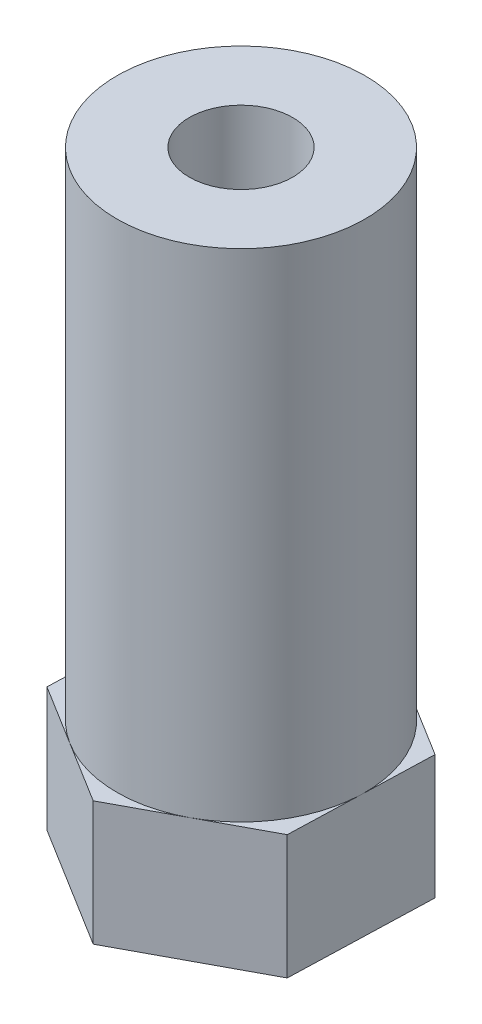
ISO-10303-21;
HEADER;
FILE_DESCRIPTION(('STEP AP214'),'2;1');
FILE_NAME('part.step','',(''),(''),'','','');
FILE_SCHEMA(('AUTOMOTIVE_DESIGN { 1 0 10303 214 1 1 1 1 }'));
ENDSEC;
DATA;
#1=APPLICATION_CONTEXT('core data for automotive mechanical design processes');
#2=APPLICATION_PROTOCOL_DEFINITION('international standard','automotive_design',2000,#1);
#3=PRODUCT_CONTEXT('',#1,'mechanical');
#4=PRODUCT('Part','Part','',(#3));
#5=PRODUCT_RELATED_PRODUCT_CATEGORY('part','',(#4));
#6=PRODUCT_DEFINITION_FORMATION('','',#4);
#7=PRODUCT_DEFINITION_CONTEXT('part definition',#1,'design');
#8=PRODUCT_DEFINITION('design','',#6,#7);
#9=PRODUCT_DEFINITION_SHAPE('','',#8);
#10=(LENGTH_UNIT() NAMED_UNIT(*) SI_UNIT(.MILLI.,.METRE.));
#11=(NAMED_UNIT(*) PLANE_ANGLE_UNIT() SI_UNIT($,.RADIAN.));
#12=(NAMED_UNIT(*) SI_UNIT($,.STERADIAN.) SOLID_ANGLE_UNIT());
#13=UNCERTAINTY_MEASURE_WITH_UNIT(LENGTH_MEASURE(1.E-05),#10,'distance_accuracy_value','');
#14=(GEOMETRIC_REPRESENTATION_CONTEXT(3) GLOBAL_UNCERTAINTY_ASSIGNED_CONTEXT((#13)) GLOBAL_UNIT_ASSIGNED_CONTEXT((#10,
#11,#12)) REPRESENTATION_CONTEXT('',''));
#15=CARTESIAN_POINT('',(0.,0.,0.));
#16=DIRECTION('',(0.,0.,1.));
#17=DIRECTION('',(1.,0.,0.));
#18=AXIS2_PLACEMENT_3D('',#15,#16,#17);
#19=CARTESIAN_POINT('',(0.,6.,0.));
#20=DIRECTION('',(0.,1.,0.));
#21=DIRECTION('',(0.,0.,1.));
#22=AXIS2_PLACEMENT_3D('',#19,#20,#21);
#23=PLANE('',#22);
#24=CARTESIAN_POINT('',(0.,6.,0.));
#25=DIRECTION('',(0.,1.,0.));
#26=DIRECTION('',(0.,0.,1.));
#27=AXIS2_PLACEMENT_3D('',#24,#25,#26);
#28=CIRCLE('',#27,6.);
#29=CARTESIAN_POINT('',(2.83420478366895,6.,5.28841027570933));
#30=VERTEX_POINT('',#29);
#31=CARTESIAN_POINT('',(5.99700003623342,6.,0.189711795669974));
#32=VERTEX_POINT('',#31);
#33=EDGE_CURVE('E54',#30,#32,#28,.T.);
#34=ORIENTED_EDGE('',*,*,#33,.F.);
#35=DIRECTION('',(0.881401712618222,0.,-0.472367463944826));
#36=VECTOR('',#35,1.);
#37=CARTESIAN_POINT('',(-0.21906031259701,6.,6.92473917049912));
#38=LINE('',#37,#36);
#39=CARTESIAN_POINT('',(5.88746987993492,6.,3.65208138091954));
#40=VERTEX_POINT('',#39);
#41=EDGE_CURVE('E125',#30,#40,#38,.T.);
#42=ORIENTED_EDGE('',*,*,#41,.T.);
#43=DIRECTION('',(0.0316186326116623,0.,-0.999500006038904));
#44=VECTOR('',#43,1.);
#45=CARTESIAN_POINT('',(5.88746987993492,6.,3.65208138091954));
#46=LINE('',#45,#44);
#47=EDGE_CURVE('E137',#40,#32,#46,.T.);
#48=ORIENTED_EDGE('',*,*,#47,.T.);
#49=EDGE_LOOP('',(#34,#42,#48));
#50=FACE_BOUND('',#49,.T.);
#51=ADVANCED_FACE('F42',(#50),#23,.T.);
#52=CARTESIAN_POINT('',(3.16279525256447,6.,-5.09869848003936));
#53=VERTEX_POINT('',#52);
#54=EDGE_CURVE('E11',#32,#53,#28,.T.);
#55=ORIENTED_EDGE('',*,*,#54,.F.);
#56=CARTESIAN_POINT('',(6.10653019253193,6.,-3.27265778957959));
#57=VERTEX_POINT('',#56);
#58=EDGE_CURVE('E124',#32,#57,#46,.T.);
#59=ORIENTED_EDGE('',*,*,#58,.T.);
#60=DIRECTION('',(-0.849783080006559,0.,-0.527132542094078));
#61=VECTOR('',#60,1.);
#62=CARTESIAN_POINT('',(6.10653019253193,6.,-3.27265778957959));
#63=LINE('',#62,#61);
#64=EDGE_CURVE('E155',#57,#53,#63,.T.);
#65=ORIENTED_EDGE('',*,*,#64,.T.);
#66=EDGE_LOOP('',(#55,#59,#65));
#67=FACE_BOUND('',#66,.T.);
#68=ADVANCED_FACE('F238',(#67),#23,.T.);
#69=CARTESIAN_POINT('',(-2.83420478366895,6.,-5.28841027570933));
#70=VERTEX_POINT('',#69);
#71=EDGE_CURVE('E52',#53,#70,#28,.T.);
#72=ORIENTED_EDGE('',*,*,#71,.F.);
#73=CARTESIAN_POINT('',(0.219060312597013,6.,-6.92473917049912));
#74=VERTEX_POINT('',#73);
#75=EDGE_CURVE('E154',#53,#74,#63,.T.);
#76=ORIENTED_EDGE('',*,*,#75,.T.);
#77=DIRECTION('',(-0.881401712618222,0.,0.472367463944825));
#78=VECTOR('',#77,1.);
#79=CARTESIAN_POINT('',(0.219060312597013,6.,-6.92473917049912));
#80=LINE('',#79,#78);
#81=EDGE_CURVE('E160',#74,#70,#80,.T.);
#82=ORIENTED_EDGE('',*,*,#81,.T.);
#83=EDGE_LOOP('',(#72,#76,#82));
#84=FACE_BOUND('',#83,.T.);
#85=ADVANCED_FACE('F235',(#84),#23,.T.);
#86=CARTESIAN_POINT('',(-5.99700003623342,6.,-0.189711795669972));
#87=VERTEX_POINT('',#86);
#88=EDGE_CURVE('E147',#70,#87,#28,.T.);
#89=ORIENTED_EDGE('',*,*,#88,.F.);
#90=CARTESIAN_POINT('',(-5.88746987993492,6.,-3.65208138091953));
#91=VERTEX_POINT('',#90);
#92=EDGE_CURVE('E159',#70,#91,#80,.T.);
#93=ORIENTED_EDGE('',*,*,#92,.T.);
#94=DIRECTION('',(-0.031618632611662,0.,0.999500006038904));
#95=VECTOR('',#94,1.);
#96=CARTESIAN_POINT('',(-5.88746987993492,6.,-3.65208138091953));
#97=LINE('',#96,#95);
#98=EDGE_CURVE('E165',#91,#87,#97,.T.);
#99=ORIENTED_EDGE('',*,*,#98,.T.);
#100=EDGE_LOOP('',(#89,#93,#99));
#101=FACE_BOUND('',#100,.T.);
#102=ADVANCED_FACE('F230',(#101),#23,.T.);
#103=CARTESIAN_POINT('',(-3.16279525256447,6.,5.09869848003936));
#104=VERTEX_POINT('',#103);
#105=EDGE_CURVE('E69',#87,#104,#28,.T.);
#106=ORIENTED_EDGE('',*,*,#105,.F.);
#107=CARTESIAN_POINT('',(-6.10653019253193,6.,3.27265778957959));
#108=VERTEX_POINT('',#107);
#109=EDGE_CURVE('E164',#87,#108,#97,.T.);
#110=ORIENTED_EDGE('',*,*,#109,.T.);
#111=DIRECTION('',(0.849783080006559,0.,0.527132542094078));
#112=VECTOR('',#111,1.);
#113=CARTESIAN_POINT('',(-6.10653019253193,6.,3.27265778957959));
#114=LINE('',#113,#112);
#115=EDGE_CURVE('E169',#108,#104,#114,.T.);
#116=ORIENTED_EDGE('',*,*,#115,.T.);
#117=EDGE_LOOP('',(#106,#110,#116));
#118=FACE_BOUND('',#117,.T.);
#119=ADVANCED_FACE('F273',(#118),#23,.T.);
#120=CARTESIAN_POINT('',(-0.21906031259701,6.,6.92473917049912));
#121=DIRECTION('',(-0.472367463944826,0.,-0.881401712618221));
#122=DIRECTION('',(-0.881401712618222,0.,0.472367463944826));
#123=AXIS2_PLACEMENT_3D('',#120,#121,#122);
#124=PLANE('',#123);
#125=DIRECTION('',(0.881401712618222,0.,-0.472367463944826));
#126=VECTOR('',#125,1.);
#127=CARTESIAN_POINT('',(-0.21906031259701,0.,6.92473917049912));
#128=LINE('',#127,#126);
#129=CARTESIAN_POINT('',(-0.21906031259701,0.,6.92473917049912));
#130=VERTEX_POINT('',#129);
#131=CARTESIAN_POINT('',(5.88746987993492,0.,3.65208138091954));
#132=VERTEX_POINT('',#131);
#133=EDGE_CURVE('E173',#130,#132,#128,.T.);
#134=ORIENTED_EDGE('',*,*,#133,.T.);
#135=DIRECTION('',(0.,-1.,0.));
#136=VECTOR('',#135,1.);
#137=CARTESIAN_POINT('',(5.88746987993492,6.,3.65208138091954));
#138=LINE('',#137,#136);
#139=EDGE_CURVE('E46',#40,#132,#138,.T.);
#140=ORIENTED_EDGE('',*,*,#139,.F.);
#141=ORIENTED_EDGE('',*,*,#41,.F.);
#142=CARTESIAN_POINT('',(-0.21906031259701,6.,6.92473917049912));
#143=VERTEX_POINT('',#142);
#144=EDGE_CURVE('E116',#143,#30,#38,.T.);
#145=ORIENTED_EDGE('',*,*,#144,.F.);
#146=DIRECTION('',(0.,-1.,0.));
#147=VECTOR('',#146,1.);
#148=CARTESIAN_POINT('',(-0.21906031259701,6.,6.92473917049912));
#149=LINE('',#148,#147);
#150=EDGE_CURVE('E172',#143,#130,#149,.T.);
#151=ORIENTED_EDGE('',*,*,#150,.T.);
#152=EDGE_LOOP('',(#134,#140,#141,#145,#151));
#153=FACE_BOUND('',#152,.T.);
#154=ADVANCED_FACE('F44',(#153),#124,.F.);
#155=CARTESIAN_POINT('',(5.88746987993492,6.,3.65208138091954));
#156=DIRECTION('',(-0.999500006038904,0.,-0.0316186326116623));
#157=DIRECTION('',(-0.0316186326116623,0.,0.999500006038904));
#158=AXIS2_PLACEMENT_3D('',#155,#156,#157);
#159=PLANE('',#158);
#160=DIRECTION('',(0.0316186326116623,0.,-0.999500006038904));
#161=VECTOR('',#160,1.);
#162=CARTESIAN_POINT('',(5.88746987993492,0.,3.65208138091954));
#163=LINE('',#162,#161);
#164=CARTESIAN_POINT('',(6.10653019253193,0.,-3.27265778957959));
#165=VERTEX_POINT('',#164);
#166=EDGE_CURVE('E176',#132,#165,#163,.T.);
#167=ORIENTED_EDGE('',*,*,#166,.T.);
#168=DIRECTION('',(0.,-1.,0.));
#169=VECTOR('',#168,1.);
#170=CARTESIAN_POINT('',(6.10653019253193,6.,-3.27265778957959));
#171=LINE('',#170,#169);
#172=EDGE_CURVE('E148',#57,#165,#171,.T.);
#173=ORIENTED_EDGE('',*,*,#172,.F.);
#174=ORIENTED_EDGE('',*,*,#58,.F.);
#175=ORIENTED_EDGE('',*,*,#47,.F.);
#176=ORIENTED_EDGE('',*,*,#139,.T.);
#177=EDGE_LOOP('',(#167,#173,#174,#175,#176));
#178=FACE_BOUND('',#177,.T.);
#179=ADVANCED_FACE('F353',(#178),#159,.F.);
#180=CARTESIAN_POINT('',(6.10653019253193,6.,-3.27265778957959));
#181=DIRECTION('',(-0.527132542094078,0.,0.849783080006559));
#182=DIRECTION('',(0.84978308000656,0.,0.527132542094078));
#183=AXIS2_PLACEMENT_3D('',#180,#181,#182);
#184=PLANE('',#183);
#185=DIRECTION('',(-0.849783080006559,0.,-0.527132542094078));
#186=VECTOR('',#185,1.);
#187=CARTESIAN_POINT('',(6.10653019253193,0.,-3.27265778957959));
#188=LINE('',#187,#186);
#189=CARTESIAN_POINT('',(0.219060312597013,0.,-6.92473917049912));
#190=VERTEX_POINT('',#189);
#191=EDGE_CURVE('E179',#165,#190,#188,.T.);
#192=ORIENTED_EDGE('',*,*,#191,.T.);
#193=DIRECTION('',(0.,-1.,0.));
#194=VECTOR('',#193,1.);
#195=CARTESIAN_POINT('',(0.219060312597013,6.,-6.92473917049912));
#196=LINE('',#195,#194);
#197=EDGE_CURVE('E200',#74,#190,#196,.T.);
#198=ORIENTED_EDGE('',*,*,#197,.F.);
#199=ORIENTED_EDGE('',*,*,#75,.F.);
#200=ORIENTED_EDGE('',*,*,#64,.F.);
#201=ORIENTED_EDGE('',*,*,#172,.T.);
#202=EDGE_LOOP('',(#192,#198,#199,#200,#201));
#203=FACE_BOUND('',#202,.T.);
#204=ADVANCED_FACE('F209',(#203),#184,.F.);
#205=CARTESIAN_POINT('',(0.219060312597013,6.,-6.92473917049912));
#206=DIRECTION('',(0.472367463944826,0.,0.881401712618222));
#207=DIRECTION('',(0.881401712618222,0.,-0.472367463944826));
#208=AXIS2_PLACEMENT_3D('',#205,#206,#207);
#209=PLANE('',#208);
#210=DIRECTION('',(-0.881401712618222,0.,0.472367463944825));
#211=VECTOR('',#210,1.);
#212=CARTESIAN_POINT('',(0.219060312597013,0.,-6.92473917049912));
#213=LINE('',#212,#211);
#214=CARTESIAN_POINT('',(-5.88746987993492,0.,-3.65208138091953));
#215=VERTEX_POINT('',#214);
#216=EDGE_CURVE('E182',#190,#215,#213,.T.);
#217=ORIENTED_EDGE('',*,*,#216,.T.);
#218=DIRECTION('',(0.,-1.,0.));
#219=VECTOR('',#218,1.);
#220=CARTESIAN_POINT('',(-5.88746987993492,6.,-3.65208138091953));
#221=LINE('',#220,#219);
#222=EDGE_CURVE('E196',#91,#215,#221,.T.);
#223=ORIENTED_EDGE('',*,*,#222,.F.);
#224=ORIENTED_EDGE('',*,*,#92,.F.);
#225=ORIENTED_EDGE('',*,*,#81,.F.);
#226=ORIENTED_EDGE('',*,*,#197,.T.);
#227=EDGE_LOOP('',(#217,#223,#224,#225,#226));
#228=FACE_BOUND('',#227,.T.);
#229=ADVANCED_FACE('F222',(#228),#209,.F.);
#230=CARTESIAN_POINT('',(-5.88746987993492,6.,-3.65208138091953));
#231=DIRECTION('',(0.999500006038904,0.,0.031618632611662));
#232=DIRECTION('',(0.031618632611662,0.,-0.999500006038904));
#233=AXIS2_PLACEMENT_3D('',#230,#231,#232);
#234=PLANE('',#233);
#235=DIRECTION('',(-0.031618632611662,0.,0.999500006038904));
#236=VECTOR('',#235,1.);
#237=CARTESIAN_POINT('',(-5.88746987993492,0.,-3.65208138091953));
#238=LINE('',#237,#236);
#239=CARTESIAN_POINT('',(-6.10653019253193,0.,3.27265778957959));
#240=VERTEX_POINT('',#239);
#241=EDGE_CURVE('E185',#215,#240,#238,.T.);
#242=ORIENTED_EDGE('',*,*,#241,.T.);
#243=DIRECTION('',(0.,-1.,0.));
#244=VECTOR('',#243,1.);
#245=CARTESIAN_POINT('',(-6.10653019253193,6.,3.27265778957959));
#246=LINE('',#245,#244);
#247=EDGE_CURVE('E192',#108,#240,#246,.T.);
#248=ORIENTED_EDGE('',*,*,#247,.F.);
#249=ORIENTED_EDGE('',*,*,#109,.F.);
#250=ORIENTED_EDGE('',*,*,#98,.F.);
#251=ORIENTED_EDGE('',*,*,#222,.T.);
#252=EDGE_LOOP('',(#242,#248,#249,#250,#251));
#253=FACE_BOUND('',#252,.T.);
#254=ADVANCED_FACE('F227',(#253),#234,.F.);
#255=CARTESIAN_POINT('',(-6.10653019253193,6.,3.27265778957959));
#256=DIRECTION('',(0.527132542094078,0.,-0.849783080006559));
#257=DIRECTION('',(-0.84978308000656,0.,-0.527132542094078));
#258=AXIS2_PLACEMENT_3D('',#255,#256,#257);
#259=PLANE('',#258);
#260=DIRECTION('',(0.849783080006559,0.,0.527132542094078));
#261=VECTOR('',#260,1.);
#262=CARTESIAN_POINT('',(-6.10653019253193,0.,3.27265778957959));
#263=LINE('',#262,#261);
#264=EDGE_CURVE('E135',#240,#130,#263,.T.);
#265=ORIENTED_EDGE('',*,*,#264,.T.);
#266=ORIENTED_EDGE('',*,*,#150,.F.);
#267=EDGE_CURVE('E119',#104,#143,#114,.T.);
#268=ORIENTED_EDGE('',*,*,#267,.F.);
#269=ORIENTED_EDGE('',*,*,#115,.F.);
#270=ORIENTED_EDGE('',*,*,#247,.T.);
#271=EDGE_LOOP('',(#265,#266,#268,#269,#270));
#272=FACE_BOUND('',#271,.T.);
#273=ADVANCED_FACE('F271',(#272),#259,.F.);
#274=EDGE_CURVE('E61',#104,#30,#28,.T.);
#275=ORIENTED_EDGE('',*,*,#274,.F.);
#276=ORIENTED_EDGE('',*,*,#267,.T.);
#277=ORIENTED_EDGE('',*,*,#144,.T.);
#278=EDGE_LOOP('',(#275,#276,#277));
#279=FACE_BOUND('',#278,.T.);
#280=ADVANCED_FACE('F118',(#279),#23,.T.);
#281=CARTESIAN_POINT('',(0.,0.,0.));
#282=DIRECTION('',(0.,1.,0.));
#283=DIRECTION('',(0.,0.,1.));
#284=AXIS2_PLACEMENT_3D('',#281,#282,#283);
#285=PLANE('',#284);
#286=CARTESIAN_POINT('',(0.,0.,0.));
#287=DIRECTION('',(0.,-1.,0.));
#288=DIRECTION('',(0.,0.,-1.));
#289=AXIS2_PLACEMENT_3D('',#286,#287,#288);
#290=CIRCLE('',#289,2.);
#291=CARTESIAN_POINT('',(0.,0.,-2.));
#292=VERTEX_POINT('',#291);
#293=EDGE_CURVE('E252',#292,#292,#290,.T.);
#294=ORIENTED_EDGE('',*,*,#293,.F.);
#295=EDGE_LOOP('',(#294));
#296=FACE_BOUND('',#295,.T.);
#297=ORIENTED_EDGE('',*,*,#133,.F.);
#298=ORIENTED_EDGE('',*,*,#264,.F.);
#299=ORIENTED_EDGE('',*,*,#241,.F.);
#300=ORIENTED_EDGE('',*,*,#216,.F.);
#301=ORIENTED_EDGE('',*,*,#191,.F.);
#302=ORIENTED_EDGE('',*,*,#166,.F.);
#303=EDGE_LOOP('',(#297,#298,#299,#300,#301,#302));
#304=FACE_BOUND('',#303,.T.);
#305=ADVANCED_FACE('F217',(#296,#304),#285,.F.);
#306=CARTESIAN_POINT('',(0.,30.,0.));
#307=DIRECTION('',(0.,-1.,0.));
#308=DIRECTION('',(0.,0.,-1.));
#309=AXIS2_PLACEMENT_3D('',#306,#307,#308);
#310=CYLINDRICAL_SURFACE('',#309,6.);
#311=CARTESIAN_POINT('',(0.,30.,0.));
#312=DIRECTION('',(0.,1.,0.));
#313=DIRECTION('',(0.,0.,1.));
#314=AXIS2_PLACEMENT_3D('',#311,#312,#313);
#315=CIRCLE('',#314,6.);
#316=CARTESIAN_POINT('',(0.,30.,6.));
#317=VERTEX_POINT('',#316);
#318=EDGE_CURVE('E140',#317,#317,#315,.T.);
#319=ORIENTED_EDGE('',*,*,#318,.F.);
#320=EDGE_LOOP('',(#319));
#321=FACE_BOUND('',#320,.T.);
#322=ORIENTED_EDGE('',*,*,#33,.T.);
#323=ORIENTED_EDGE('',*,*,#54,.T.);
#324=ORIENTED_EDGE('',*,*,#71,.T.);
#325=ORIENTED_EDGE('',*,*,#88,.T.);
#326=ORIENTED_EDGE('',*,*,#105,.T.);
#327=ORIENTED_EDGE('',*,*,#274,.T.);
#328=EDGE_LOOP('',(#322,#323,#324,#325,#326,#327));
#329=FACE_BOUND('',#328,.T.);
#330=ADVANCED_FACE('F142',(#321,#329),#310,.T.);
#331=CARTESIAN_POINT('',(0.,30.,0.));
#332=DIRECTION('',(0.,1.,0.));
#333=DIRECTION('',(0.,0.,1.));
#334=AXIS2_PLACEMENT_3D('',#331,#332,#333);
#335=PLANE('',#334);
#336=CARTESIAN_POINT('',(0.,30.,0.));
#337=DIRECTION('',(0.,1.,0.));
#338=DIRECTION('',(0.,0.,1.));
#339=AXIS2_PLACEMENT_3D('',#336,#337,#338);
#340=CIRCLE('',#339,2.5);
#341=CARTESIAN_POINT('',(0.,30.,2.5));
#342=VERTEX_POINT('',#341);
#343=EDGE_CURVE('E245',#342,#342,#340,.T.);
#344=ORIENTED_EDGE('',*,*,#343,.F.);
#345=EDGE_LOOP('',(#344));
#346=FACE_BOUND('',#345,.T.);
#347=ORIENTED_EDGE('',*,*,#318,.T.);
#348=EDGE_LOOP('',(#347));
#349=FACE_BOUND('',#348,.T.);
#350=ADVANCED_FACE('F267',(#346,#349),#335,.T.);
#351=CARTESIAN_POINT('',(0.,6.,0.));
#352=DIRECTION('',(0.,1.,0.));
#353=DIRECTION('',(0.,0.,1.));
#354=AXIS2_PLACEMENT_3D('',#351,#352,#353);
#355=CYLINDRICAL_SURFACE('',#354,2.5);
#356=CARTESIAN_POINT('',(0.,6.,0.));
#357=DIRECTION('',(0.,1.,0.));
#358=DIRECTION('',(0.,0.,1.));
#359=AXIS2_PLACEMENT_3D('',#356,#357,#358);
#360=CIRCLE('',#359,2.5);
#361=CARTESIAN_POINT('',(0.,6.,2.5));
#362=VERTEX_POINT('',#361);
#363=EDGE_CURVE('E141',#362,#362,#360,.T.);
#364=ORIENTED_EDGE('',*,*,#363,.F.);
#365=EDGE_LOOP('',(#364));
#366=FACE_BOUND('',#365,.T.);
#367=ORIENTED_EDGE('',*,*,#343,.T.);
#368=EDGE_LOOP('',(#367));
#369=FACE_BOUND('',#368,.T.);
#370=ADVANCED_FACE('F282',(#366,#369),#355,.F.);
#371=CARTESIAN_POINT('',(0.,6.,0.));
#372=DIRECTION('',(0.,1.,0.));
#373=DIRECTION('',(0.,0.,1.));
#374=AXIS2_PLACEMENT_3D('',#371,#372,#373);
#375=PLANE('',#374);
#376=CARTESIAN_POINT('',(0.,6.,0.));
#377=DIRECTION('',(0.,-1.,0.));
#378=DIRECTION('',(0.,0.,-1.));
#379=AXIS2_PLACEMENT_3D('',#376,#377,#378);
#380=CIRCLE('',#379,2.);
#381=CARTESIAN_POINT('',(0.,6.,-2.));
#382=VERTEX_POINT('',#381);
#383=EDGE_CURVE('E249',#382,#382,#380,.T.);
#384=ORIENTED_EDGE('',*,*,#383,.T.);
#385=EDGE_LOOP('',(#384));
#386=FACE_BOUND('',#385,.T.);
#387=ORIENTED_EDGE('',*,*,#363,.T.);
#388=EDGE_LOOP('',(#387));
#389=FACE_BOUND('',#388,.T.);
#390=ADVANCED_FACE('F286',(#386,#389),#375,.T.);
#391=CARTESIAN_POINT('',(0.,6.,0.));
#392=DIRECTION('',(0.,-1.,0.));
#393=DIRECTION('',(0.,0.,-1.));
#394=AXIS2_PLACEMENT_3D('',#391,#392,#393);
#395=CYLINDRICAL_SURFACE('',#394,2.);
#396=ORIENTED_EDGE('',*,*,#383,.F.);
#397=EDGE_LOOP('',(#396));
#398=FACE_BOUND('',#397,.T.);
#399=ORIENTED_EDGE('',*,*,#293,.T.);
#400=EDGE_LOOP('',(#399));
#401=FACE_BOUND('',#400,.T.);
#402=ADVANCED_FACE('F258',(#398,#401),#395,.F.);
#403=CLOSED_SHELL('',(#51,#68,#85,#102,#119,#154,#179,#204,#229,#254,#273,#280,#305,#330,#350,
#370,#390,#402));
#404=MANIFOLD_SOLID_BREP('B2',#403);
#405=ADVANCED_BREP_SHAPE_REPRESENTATION('',(#18,#404),#14);
#406=SHAPE_DEFINITION_REPRESENTATION(#9,#405);
ENDSEC;
END-ISO-10303-21;
